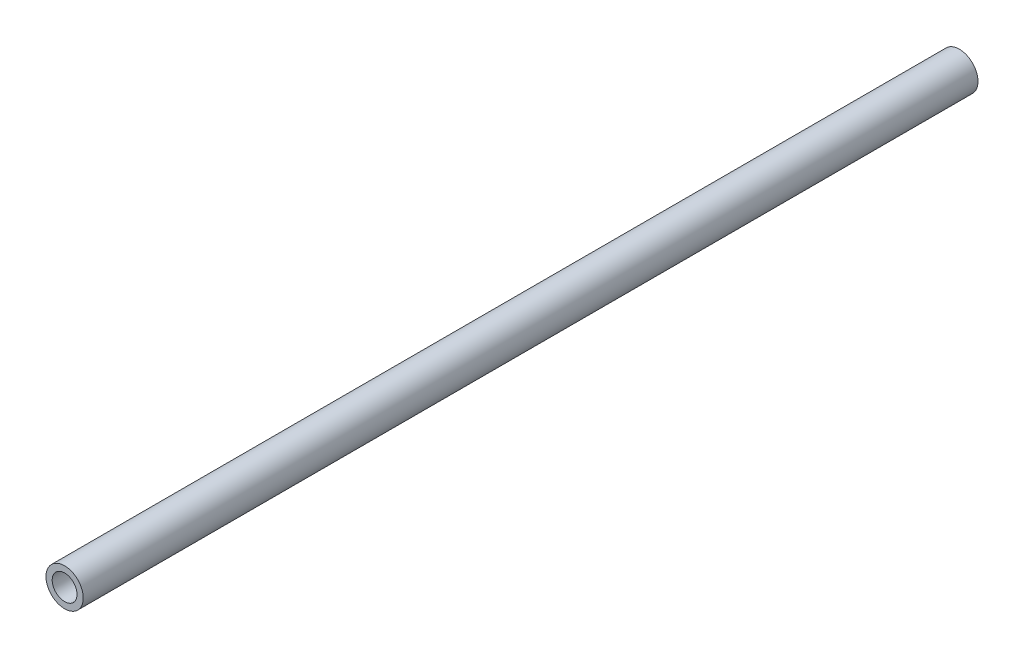
ISO-10303-21;
HEADER;
FILE_DESCRIPTION(('STEP AP214'),'2;1');
FILE_NAME('part.step','',(''),(''),'','','');
FILE_SCHEMA(('AUTOMOTIVE_DESIGN { 1 0 10303 214 1 1 1 1 }'));
ENDSEC;
DATA;
#1=APPLICATION_CONTEXT('core data for automotive mechanical design processes');
#2=APPLICATION_PROTOCOL_DEFINITION('international standard','automotive_design',2000,#1);
#3=PRODUCT_CONTEXT('',#1,'mechanical');
#4=PRODUCT('Part','Part','',(#3));
#5=PRODUCT_RELATED_PRODUCT_CATEGORY('part','',(#4));
#6=PRODUCT_DEFINITION_FORMATION('','',#4);
#7=PRODUCT_DEFINITION_CONTEXT('part definition',#1,'design');
#8=PRODUCT_DEFINITION('design','',#6,#7);
#9=PRODUCT_DEFINITION_SHAPE('','',#8);
#10=(LENGTH_UNIT() NAMED_UNIT(*) SI_UNIT(.MILLI.,.METRE.));
#11=(NAMED_UNIT(*) PLANE_ANGLE_UNIT() SI_UNIT($,.RADIAN.));
#12=(NAMED_UNIT(*) SI_UNIT($,.STERADIAN.) SOLID_ANGLE_UNIT());
#13=UNCERTAINTY_MEASURE_WITH_UNIT(LENGTH_MEASURE(1.E-05),#10,'distance_accuracy_value','');
#14=(GEOMETRIC_REPRESENTATION_CONTEXT(3) GLOBAL_UNCERTAINTY_ASSIGNED_CONTEXT((#13)) GLOBAL_UNIT_ASSIGNED_CONTEXT((#10,
#11,#12)) REPRESENTATION_CONTEXT('',''));
#15=CARTESIAN_POINT('',(0.,0.,0.));
#16=DIRECTION('',(0.,0.,1.));
#17=DIRECTION('',(1.,0.,0.));
#18=AXIS2_PLACEMENT_3D('',#15,#16,#17);
#19=CARTESIAN_POINT('',(0.,0.,-457.2));
#20=DIRECTION('',(0.,0.,-1.));
#21=DIRECTION('',(1.,0.,0.));
#22=AXIS2_PLACEMENT_3D('',#19,#20,#21);
#23=PLANE('',#22);
#24=CARTESIAN_POINT('',(0.,0.,-457.2));
#25=DIRECTION('',(0.,0.,1.));
#26=DIRECTION('',(1.,0.,0.));
#27=AXIS2_PLACEMENT_3D('',#24,#25,#26);
#28=CIRCLE('',#27,9.525);
#29=CARTESIAN_POINT('',(9.525,0.,-457.2));
#30=VERTEX_POINT('',#29);
#31=EDGE_CURVE('E10',#30,#30,#28,.T.);
#32=ORIENTED_EDGE('',*,*,#31,.F.);
#33=EDGE_LOOP('',(#32));
#34=FACE_BOUND('',#33,.T.);
#35=CARTESIAN_POINT('',(0.,0.,-457.2));
#36=DIRECTION('',(0.,0.,1.));
#37=DIRECTION('',(1.,0.,0.));
#38=AXIS2_PLACEMENT_3D('',#35,#36,#37);
#39=CIRCLE('',#38,6.35);
#40=CARTESIAN_POINT('',(6.35,0.,-457.2));
#41=VERTEX_POINT('',#40);
#42=EDGE_CURVE('E52',#41,#41,#39,.T.);
#43=ORIENTED_EDGE('',*,*,#42,.T.);
#44=EDGE_LOOP('',(#43));
#45=FACE_BOUND('',#44,.T.);
#46=ADVANCED_FACE('F41',(#34,#45),#23,.T.);
#47=CARTESIAN_POINT('',(0.,0.,0.));
#48=DIRECTION('',(0.,0.,-1.));
#49=DIRECTION('',(1.,0.,0.));
#50=AXIS2_PLACEMENT_3D('',#47,#48,#49);
#51=PLANE('',#50);
#52=CARTESIAN_POINT('',(0.,0.,0.));
#53=DIRECTION('',(0.,0.,1.));
#54=DIRECTION('',(1.,0.,0.));
#55=AXIS2_PLACEMENT_3D('',#52,#53,#54);
#56=CIRCLE('',#55,9.525);
#57=CARTESIAN_POINT('',(9.525,0.,0.));
#58=VERTEX_POINT('',#57);
#59=EDGE_CURVE('E45',#58,#58,#56,.T.);
#60=ORIENTED_EDGE('',*,*,#59,.T.);
#61=EDGE_LOOP('',(#60));
#62=FACE_BOUND('',#61,.T.);
#63=CARTESIAN_POINT('',(0.,0.,0.));
#64=DIRECTION('',(0.,0.,1.));
#65=DIRECTION('',(1.,0.,0.));
#66=AXIS2_PLACEMENT_3D('',#63,#64,#65);
#67=CIRCLE('',#66,6.35);
#68=CARTESIAN_POINT('',(6.35,0.,0.));
#69=VERTEX_POINT('',#68);
#70=EDGE_CURVE('E54',#69,#69,#67,.T.);
#71=ORIENTED_EDGE('',*,*,#70,.F.);
#72=EDGE_LOOP('',(#71));
#73=FACE_BOUND('',#72,.T.);
#74=ADVANCED_FACE('F67',(#62,#73),#51,.F.);
#75=CARTESIAN_POINT('',(0.,0.,-457.2));
#76=DIRECTION('',(0.,0.,1.));
#77=DIRECTION('',(-1.,0.,0.));
#78=AXIS2_PLACEMENT_3D('',#75,#76,#77);
#79=CYLINDRICAL_SURFACE('',#78,9.525);
#80=ORIENTED_EDGE('',*,*,#31,.T.);
#81=EDGE_LOOP('',(#80));
#82=FACE_BOUND('',#81,.T.);
#83=ORIENTED_EDGE('',*,*,#59,.F.);
#84=EDGE_LOOP('',(#83));
#85=FACE_BOUND('',#84,.T.);
#86=ADVANCED_FACE('F43',(#82,#85),#79,.T.);
#87=CARTESIAN_POINT('',(0.,0.,-457.2));
#88=DIRECTION('',(0.,0.,1.));
#89=DIRECTION('',(-1.,0.,0.));
#90=AXIS2_PLACEMENT_3D('',#87,#88,#89);
#91=CYLINDRICAL_SURFACE('',#90,6.35);
#92=ORIENTED_EDGE('',*,*,#42,.F.);
#93=EDGE_LOOP('',(#92));
#94=FACE_BOUND('',#93,.T.);
#95=ORIENTED_EDGE('',*,*,#70,.T.);
#96=EDGE_LOOP('',(#95));
#97=FACE_BOUND('',#96,.T.);
#98=ADVANCED_FACE('F61',(#94,#97),#91,.F.);
#99=CLOSED_SHELL('',(#46,#74,#86,#98));
#100=MANIFOLD_SOLID_BREP('B2',#99);
#101=ADVANCED_BREP_SHAPE_REPRESENTATION('',(#18,#100),#14);
#102=SHAPE_DEFINITION_REPRESENTATION(#9,#101);
ENDSEC;
END-ISO-10303-21;
